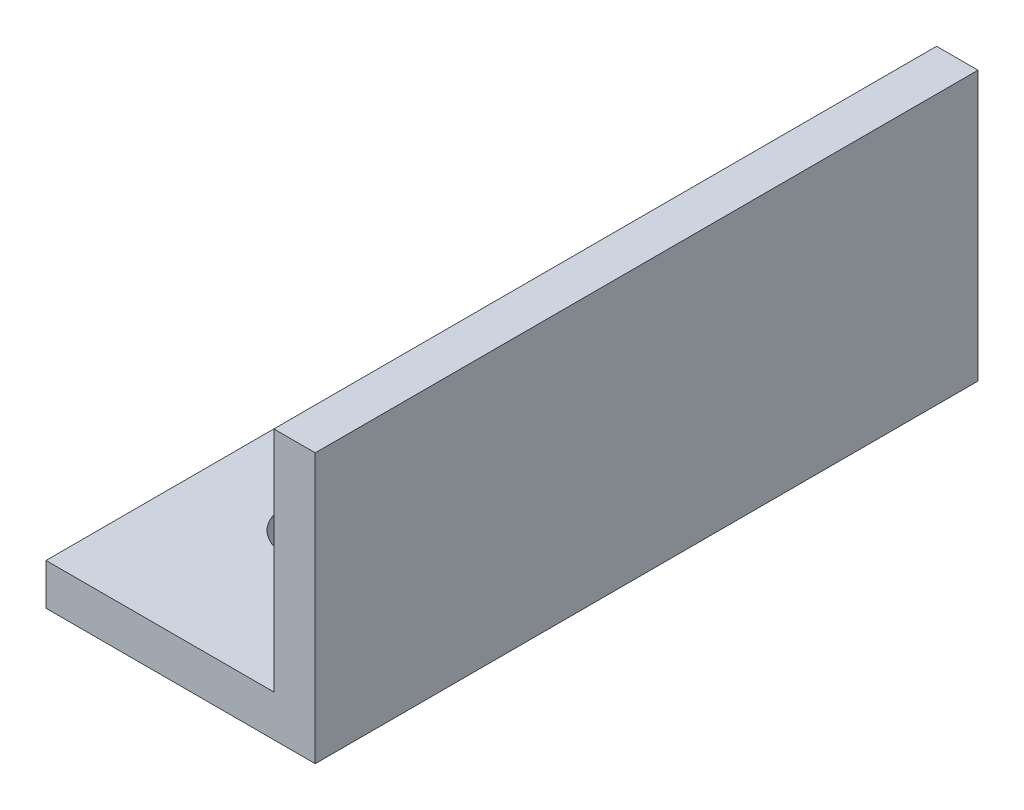
ISO-10303-21;
HEADER;
FILE_DESCRIPTION(('STEP AP214'),'2;1');
FILE_NAME('part.step','',(''),(''),'','','');
FILE_SCHEMA(('AUTOMOTIVE_DESIGN { 1 0 10303 214 1 1 1 1 }'));
ENDSEC;
DATA;
#1=APPLICATION_CONTEXT('core data for automotive mechanical design processes');
#2=APPLICATION_PROTOCOL_DEFINITION('international standard','automotive_design',2000,#1);
#3=PRODUCT_CONTEXT('',#1,'mechanical');
#4=PRODUCT('Part','Part','',(#3));
#5=PRODUCT_RELATED_PRODUCT_CATEGORY('part','',(#4));
#6=PRODUCT_DEFINITION_FORMATION('','',#4);
#7=PRODUCT_DEFINITION_CONTEXT('part definition',#1,'design');
#8=PRODUCT_DEFINITION('design','',#6,#7);
#9=PRODUCT_DEFINITION_SHAPE('','',#8);
#10=(LENGTH_UNIT() NAMED_UNIT(*) SI_UNIT(.MILLI.,.METRE.));
#11=(NAMED_UNIT(*) PLANE_ANGLE_UNIT() SI_UNIT($,.RADIAN.));
#12=(NAMED_UNIT(*) SI_UNIT($,.STERADIAN.) SOLID_ANGLE_UNIT());
#13=UNCERTAINTY_MEASURE_WITH_UNIT(LENGTH_MEASURE(1.E-05),#10,'distance_accuracy_value','');
#14=(GEOMETRIC_REPRESENTATION_CONTEXT(3) GLOBAL_UNCERTAINTY_ASSIGNED_CONTEXT((#13)) GLOBAL_UNIT_ASSIGNED_CONTEXT((#10,
#11,#12)) REPRESENTATION_CONTEXT('',''));
#15=CARTESIAN_POINT('',(0.,0.,0.));
#16=DIRECTION('',(0.,0.,1.));
#17=DIRECTION('',(1.,0.,0.));
#18=AXIS2_PLACEMENT_3D('',#15,#16,#17);
#19=CARTESIAN_POINT('',(0.,2.,0.));
#20=DIRECTION('',(0.,-1.,0.));
#21=DIRECTION('',(0.,0.,-1.));
#22=AXIS2_PLACEMENT_3D('',#19,#20,#21);
#23=PLANE('',#22);
#24=CARTESIAN_POINT('',(5.5,2.,-24.));
#25=DIRECTION('',(0.,1.,0.));
#26=DIRECTION('',(0.,0.,1.));
#27=AXIS2_PLACEMENT_3D('',#24,#25,#26);
#28=CIRCLE('',#27,2.);
#29=CARTESIAN_POINT('',(5.5,2.,-22.));
#30=VERTEX_POINT('',#29);
#31=EDGE_CURVE('E125',#30,#30,#28,.T.);
#32=ORIENTED_EDGE('',*,*,#31,.F.);
#33=EDGE_LOOP('',(#32));
#34=FACE_BOUND('',#33,.T.);
#35=CARTESIAN_POINT('',(5.5,2.,-8.));
#36=DIRECTION('',(0.,1.,0.));
#37=DIRECTION('',(0.,0.,1.));
#38=AXIS2_PLACEMENT_3D('',#35,#36,#37);
#39=CIRCLE('',#38,2.);
#40=CARTESIAN_POINT('',(5.5,2.,-6.));
#41=VERTEX_POINT('',#40);
#42=EDGE_CURVE('E119',#41,#41,#39,.T.);
#43=ORIENTED_EDGE('',*,*,#42,.F.);
#44=EDGE_LOOP('',(#43));
#45=FACE_BOUND('',#44,.T.);
#46=DIRECTION('',(0.,0.,1.));
#47=VECTOR('',#46,1.);
#48=CARTESIAN_POINT('',(11.,2.,0.));
#49=LINE('',#48,#47);
#50=CARTESIAN_POINT('',(11.,2.,-32.));
#51=VERTEX_POINT('',#50);
#52=CARTESIAN_POINT('',(11.,2.,0.));
#53=VERTEX_POINT('',#52);
#54=EDGE_CURVE('E47',#51,#53,#49,.T.);
#55=ORIENTED_EDGE('',*,*,#54,.F.);
#56=DIRECTION('',(-1.,0.,0.));
#57=VECTOR('',#56,1.);
#58=CARTESIAN_POINT('',(0.,2.,-32.));
#59=LINE('',#58,#57);
#60=CARTESIAN_POINT('',(0.,2.,-32.));
#61=VERTEX_POINT('',#60);
#62=EDGE_CURVE('E52',#51,#61,#59,.T.);
#63=ORIENTED_EDGE('',*,*,#62,.T.);
#64=DIRECTION('',(0.,0.,1.));
#65=VECTOR('',#64,1.);
#66=CARTESIAN_POINT('',(0.,2.,0.));
#67=LINE('',#66,#65);
#68=CARTESIAN_POINT('',(0.,2.,0.));
#69=VERTEX_POINT('',#68);
#70=EDGE_CURVE('E77',#61,#69,#67,.T.);
#71=ORIENTED_EDGE('',*,*,#70,.T.);
#72=DIRECTION('',(1.,0.,0.));
#73=VECTOR('',#72,1.);
#74=CARTESIAN_POINT('',(0.,2.,0.));
#75=LINE('',#74,#73);
#76=EDGE_CURVE('E92',#69,#53,#75,.T.);
#77=ORIENTED_EDGE('',*,*,#76,.T.);
#78=EDGE_LOOP('',(#55,#63,#71,#77));
#79=FACE_BOUND('',#78,.T.);
#80=ADVANCED_FACE('F32',(#34,#45,#79),#23,.F.);
#81=CARTESIAN_POINT('',(0.,2.,0.));
#82=DIRECTION('',(1.,0.,0.));
#83=DIRECTION('',(0.,0.,-1.));
#84=AXIS2_PLACEMENT_3D('',#81,#82,#83);
#85=PLANE('',#84);
#86=DIRECTION('',(0.,0.,1.));
#87=VECTOR('',#86,1.);
#88=CARTESIAN_POINT('',(0.,0.,0.));
#89=LINE('',#88,#87);
#90=CARTESIAN_POINT('',(0.,0.,-32.));
#91=VERTEX_POINT('',#90);
#92=CARTESIAN_POINT('',(0.,0.,0.));
#93=VERTEX_POINT('',#92);
#94=EDGE_CURVE('E83',#91,#93,#89,.T.);
#95=ORIENTED_EDGE('',*,*,#94,.T.);
#96=DIRECTION('',(0.,-1.,0.));
#97=VECTOR('',#96,1.);
#98=CARTESIAN_POINT('',(0.,2.,0.));
#99=LINE('',#98,#97);
#100=EDGE_CURVE('E11',#69,#93,#99,.T.);
#101=ORIENTED_EDGE('',*,*,#100,.F.);
#102=ORIENTED_EDGE('',*,*,#70,.F.);
#103=DIRECTION('',(0.,-1.,0.));
#104=VECTOR('',#103,1.);
#105=CARTESIAN_POINT('',(0.,2.,-32.));
#106=LINE('',#105,#104);
#107=EDGE_CURVE('E40',#61,#91,#106,.T.);
#108=ORIENTED_EDGE('',*,*,#107,.T.);
#109=EDGE_LOOP('',(#95,#101,#102,#108));
#110=FACE_BOUND('',#109,.T.);
#111=ADVANCED_FACE('F34',(#110),#85,.F.);
#112=CARTESIAN_POINT('',(0.,2.,0.));
#113=DIRECTION('',(0.,0.,-1.));
#114=DIRECTION('',(-1.,0.,0.));
#115=AXIS2_PLACEMENT_3D('',#112,#113,#114);
#116=PLANE('',#115);
#117=DIRECTION('',(1.,0.,0.));
#118=VECTOR('',#117,1.);
#119=CARTESIAN_POINT('',(0.,0.,0.));
#120=LINE('',#119,#118);
#121=CARTESIAN_POINT('',(13.,0.,0.));
#122=VERTEX_POINT('',#121);
#123=EDGE_CURVE('E78',#93,#122,#120,.T.);
#124=ORIENTED_EDGE('',*,*,#123,.T.);
#125=DIRECTION('',(0.,-1.,0.));
#126=VECTOR('',#125,1.);
#127=CARTESIAN_POINT('',(13.,2.,0.));
#128=LINE('',#127,#126);
#129=CARTESIAN_POINT('',(13.,13.,0.));
#130=VERTEX_POINT('',#129);
#131=EDGE_CURVE('E96',#130,#122,#128,.T.);
#132=ORIENTED_EDGE('',*,*,#131,.F.);
#133=DIRECTION('',(1.,0.,0.));
#134=VECTOR('',#133,1.);
#135=CARTESIAN_POINT('',(13.,13.,0.));
#136=LINE('',#135,#134);
#137=CARTESIAN_POINT('',(11.,13.,0.));
#138=VERTEX_POINT('',#137);
#139=EDGE_CURVE('E105',#138,#130,#136,.T.);
#140=ORIENTED_EDGE('',*,*,#139,.F.);
#141=DIRECTION('',(0.,-1.,0.));
#142=VECTOR('',#141,1.);
#143=CARTESIAN_POINT('',(11.,13.,0.));
#144=LINE('',#143,#142);
#145=EDGE_CURVE('E102',#138,#53,#144,.T.);
#146=ORIENTED_EDGE('',*,*,#145,.T.);
#147=ORIENTED_EDGE('',*,*,#76,.F.);
#148=ORIENTED_EDGE('',*,*,#100,.T.);
#149=EDGE_LOOP('',(#124,#132,#140,#146,#147,#148));
#150=FACE_BOUND('',#149,.T.);
#151=ADVANCED_FACE('F167',(#150),#116,.F.);
#152=CARTESIAN_POINT('',(0.,2.,-32.));
#153=DIRECTION('',(0.,0.,1.));
#154=DIRECTION('',(1.,0.,0.));
#155=AXIS2_PLACEMENT_3D('',#152,#153,#154);
#156=PLANE('',#155);
#157=DIRECTION('',(-1.,0.,0.));
#158=VECTOR('',#157,1.);
#159=CARTESIAN_POINT('',(0.,0.,-32.));
#160=LINE('',#159,#158);
#161=CARTESIAN_POINT('',(13.,0.,-32.));
#162=VERTEX_POINT('',#161);
#163=EDGE_CURVE('E66',#162,#91,#160,.T.);
#164=ORIENTED_EDGE('',*,*,#163,.T.);
#165=ORIENTED_EDGE('',*,*,#107,.F.);
#166=ORIENTED_EDGE('',*,*,#62,.F.);
#167=DIRECTION('',(0.,-1.,0.));
#168=VECTOR('',#167,1.);
#169=CARTESIAN_POINT('',(11.,13.,-32.));
#170=LINE('',#169,#168);
#171=CARTESIAN_POINT('',(11.,13.,-32.));
#172=VERTEX_POINT('',#171);
#173=EDGE_CURVE('E99',#172,#51,#170,.T.);
#174=ORIENTED_EDGE('',*,*,#173,.F.);
#175=DIRECTION('',(-1.,0.,0.));
#176=VECTOR('',#175,1.);
#177=CARTESIAN_POINT('',(13.,13.,-32.));
#178=LINE('',#177,#176);
#179=CARTESIAN_POINT('',(13.,13.,-32.));
#180=VERTEX_POINT('',#179);
#181=EDGE_CURVE('E114',#180,#172,#178,.T.);
#182=ORIENTED_EDGE('',*,*,#181,.F.);
#183=DIRECTION('',(0.,1.,0.));
#184=VECTOR('',#183,1.);
#185=CARTESIAN_POINT('',(13.,0.,-32.));
#186=LINE('',#185,#184);
#187=EDGE_CURVE('E72',#162,#180,#186,.T.);
#188=ORIENTED_EDGE('',*,*,#187,.F.);
#189=EDGE_LOOP('',(#164,#165,#166,#174,#182,#188));
#190=FACE_BOUND('',#189,.T.);
#191=ADVANCED_FACE('F68',(#190),#156,.F.);
#192=CARTESIAN_POINT('',(0.,0.,0.));
#193=DIRECTION('',(0.,-1.,0.));
#194=DIRECTION('',(0.,0.,-1.));
#195=AXIS2_PLACEMENT_3D('',#192,#193,#194);
#196=PLANE('',#195);
#197=CARTESIAN_POINT('',(5.5,0.,-24.));
#198=DIRECTION('',(0.,1.,0.));
#199=DIRECTION('',(0.,0.,1.));
#200=AXIS2_PLACEMENT_3D('',#197,#198,#199);
#201=CIRCLE('',#200,2.);
#202=CARTESIAN_POINT('',(5.5,0.,-22.));
#203=VERTEX_POINT('',#202);
#204=EDGE_CURVE('E122',#203,#203,#201,.T.);
#205=ORIENTED_EDGE('',*,*,#204,.T.);
#206=EDGE_LOOP('',(#205));
#207=FACE_BOUND('',#206,.T.);
#208=CARTESIAN_POINT('',(5.5,0.,-8.));
#209=DIRECTION('',(0.,1.,0.));
#210=DIRECTION('',(0.,0.,1.));
#211=AXIS2_PLACEMENT_3D('',#208,#209,#210);
#212=CIRCLE('',#211,2.);
#213=CARTESIAN_POINT('',(5.5,0.,-6.));
#214=VERTEX_POINT('',#213);
#215=EDGE_CURVE('E108',#214,#214,#212,.T.);
#216=ORIENTED_EDGE('',*,*,#215,.T.);
#217=EDGE_LOOP('',(#216));
#218=FACE_BOUND('',#217,.T.);
#219=ORIENTED_EDGE('',*,*,#94,.F.);
#220=ORIENTED_EDGE('',*,*,#163,.F.);
#221=DIRECTION('',(0.,0.,-1.));
#222=VECTOR('',#221,1.);
#223=CARTESIAN_POINT('',(13.,0.,0.));
#224=LINE('',#223,#222);
#225=EDGE_CURVE('E88',#122,#162,#224,.T.);
#226=ORIENTED_EDGE('',*,*,#225,.F.);
#227=ORIENTED_EDGE('',*,*,#123,.F.);
#228=EDGE_LOOP('',(#219,#220,#226,#227));
#229=FACE_BOUND('',#228,.T.);
#230=ADVANCED_FACE('F84',(#207,#218,#229),#196,.T.);
#231=CARTESIAN_POINT('',(13.,0.,0.));
#232=DIRECTION('',(1.,0.,0.));
#233=DIRECTION('',(0.,0.,-1.));
#234=AXIS2_PLACEMENT_3D('',#231,#232,#233);
#235=PLANE('',#234);
#236=ORIENTED_EDGE('',*,*,#131,.T.);
#237=ORIENTED_EDGE('',*,*,#225,.T.);
#238=ORIENTED_EDGE('',*,*,#187,.T.);
#239=DIRECTION('',(0.,0.,-1.));
#240=VECTOR('',#239,1.);
#241=CARTESIAN_POINT('',(13.,13.,0.));
#242=LINE('',#241,#240);
#243=EDGE_CURVE('E107',#130,#180,#242,.T.);
#244=ORIENTED_EDGE('',*,*,#243,.F.);
#245=EDGE_LOOP('',(#236,#237,#238,#244));
#246=FACE_BOUND('',#245,.T.);
#247=ADVANCED_FACE('F159',(#246),#235,.T.);
#248=CARTESIAN_POINT('',(11.,13.,0.));
#249=DIRECTION('',(1.,0.,0.));
#250=DIRECTION('',(0.,0.,-1.));
#251=AXIS2_PLACEMENT_3D('',#248,#249,#250);
#252=PLANE('',#251);
#253=ORIENTED_EDGE('',*,*,#54,.T.);
#254=ORIENTED_EDGE('',*,*,#145,.F.);
#255=DIRECTION('',(0.,0.,1.));
#256=VECTOR('',#255,1.);
#257=CARTESIAN_POINT('',(11.,13.,0.));
#258=LINE('',#257,#256);
#259=EDGE_CURVE('E111',#172,#138,#258,.T.);
#260=ORIENTED_EDGE('',*,*,#259,.F.);
#261=ORIENTED_EDGE('',*,*,#173,.T.);
#262=EDGE_LOOP('',(#253,#254,#260,#261));
#263=FACE_BOUND('',#262,.T.);
#264=ADVANCED_FACE('F152',(#263),#252,.F.);
#265=CARTESIAN_POINT('',(0.,13.,0.));
#266=DIRECTION('',(0.,1.,0.));
#267=DIRECTION('',(0.,0.,1.));
#268=AXIS2_PLACEMENT_3D('',#265,#266,#267);
#269=PLANE('',#268);
#270=ORIENTED_EDGE('',*,*,#243,.T.);
#271=ORIENTED_EDGE('',*,*,#181,.T.);
#272=ORIENTED_EDGE('',*,*,#259,.T.);
#273=ORIENTED_EDGE('',*,*,#139,.T.);
#274=EDGE_LOOP('',(#270,#271,#272,#273));
#275=FACE_BOUND('',#274,.T.);
#276=ADVANCED_FACE('F146',(#275),#269,.T.);
#277=CARTESIAN_POINT('',(5.5,0.,-8.));
#278=DIRECTION('',(0.,1.,0.));
#279=DIRECTION('',(0.,0.,1.));
#280=AXIS2_PLACEMENT_3D('',#277,#278,#279);
#281=CYLINDRICAL_SURFACE('',#280,2.);
#282=ORIENTED_EDGE('',*,*,#215,.F.);
#283=EDGE_LOOP('',(#282));
#284=FACE_BOUND('',#283,.T.);
#285=ORIENTED_EDGE('',*,*,#42,.T.);
#286=EDGE_LOOP('',(#285));
#287=FACE_BOUND('',#286,.T.);
#288=ADVANCED_FACE('F136',(#284,#287),#281,.F.);
#289=CARTESIAN_POINT('',(5.5,0.,-24.));
#290=DIRECTION('',(0.,1.,0.));
#291=DIRECTION('',(0.,0.,1.));
#292=AXIS2_PLACEMENT_3D('',#289,#290,#291);
#293=CYLINDRICAL_SURFACE('',#292,2.);
#294=ORIENTED_EDGE('',*,*,#204,.F.);
#295=EDGE_LOOP('',(#294));
#296=FACE_BOUND('',#295,.T.);
#297=ORIENTED_EDGE('',*,*,#31,.T.);
#298=EDGE_LOOP('',(#297));
#299=FACE_BOUND('',#298,.T.);
#300=ADVANCED_FACE('F133',(#296,#299),#293,.F.);
#301=CLOSED_SHELL('',(#80,#111,#151,#191,#230,#247,#264,#276,#288,#300));
#302=MANIFOLD_SOLID_BREP('B2',#301);
#303=ADVANCED_BREP_SHAPE_REPRESENTATION('',(#18,#302),#14);
#304=SHAPE_DEFINITION_REPRESENTATION(#9,#303);
ENDSEC;
END-ISO-10303-21;
